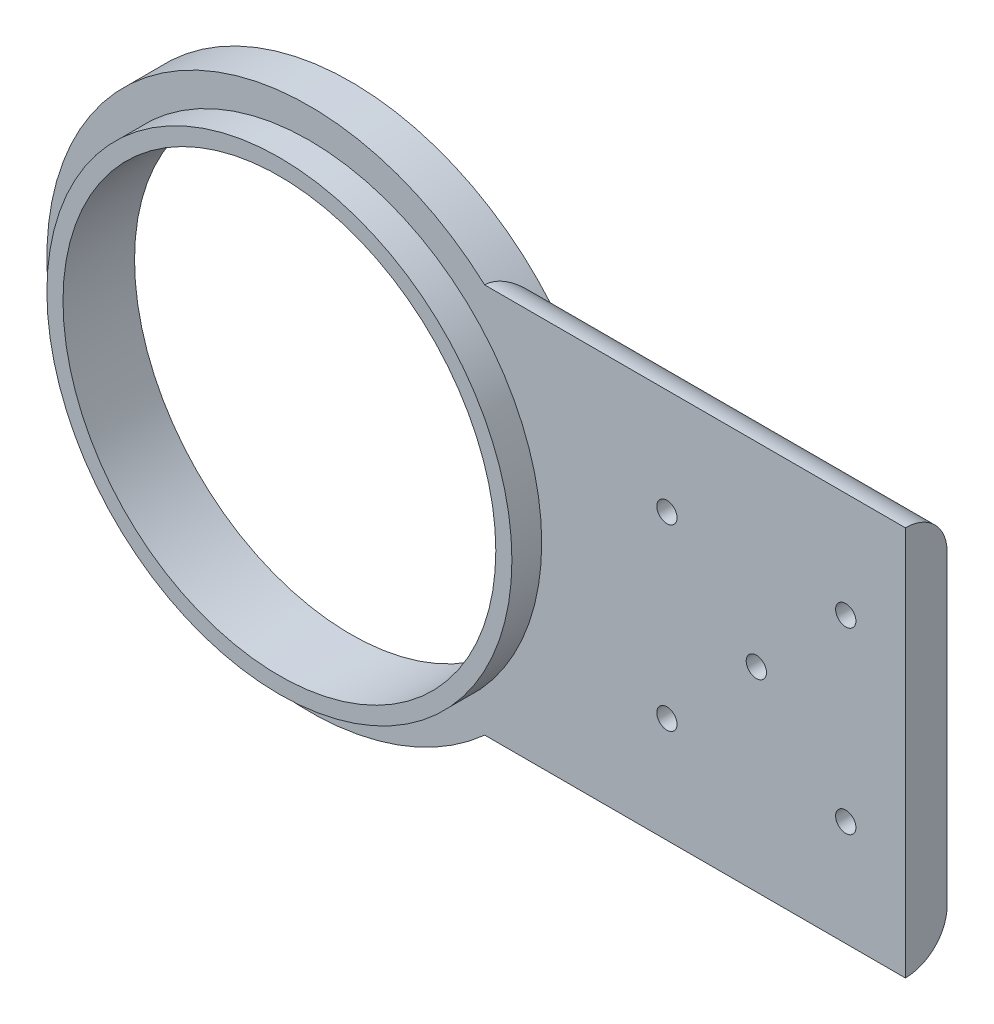
ISO-10303-21;
HEADER;
FILE_DESCRIPTION(('STEP AP214'),'2;1');
FILE_NAME('part.step','',(''),(''),'','','');
FILE_SCHEMA(('AUTOMOTIVE_DESIGN { 1 0 10303 214 1 1 1 1 }'));
ENDSEC;
DATA;
#1=APPLICATION_CONTEXT('core data for automotive mechanical design processes');
#2=APPLICATION_PROTOCOL_DEFINITION('international standard','automotive_design',2000,#1);
#3=PRODUCT_CONTEXT('',#1,'mechanical');
#4=PRODUCT('Part','Part','',(#3));
#5=PRODUCT_RELATED_PRODUCT_CATEGORY('part','',(#4));
#6=PRODUCT_DEFINITION_FORMATION('','',#4);
#7=PRODUCT_DEFINITION_CONTEXT('part definition',#1,'design');
#8=PRODUCT_DEFINITION('design','',#6,#7);
#9=PRODUCT_DEFINITION_SHAPE('','',#8);
#10=(LENGTH_UNIT() NAMED_UNIT(*) SI_UNIT(.MILLI.,.METRE.));
#11=(NAMED_UNIT(*) PLANE_ANGLE_UNIT() SI_UNIT($,.RADIAN.));
#12=(NAMED_UNIT(*) SI_UNIT($,.STERADIAN.) SOLID_ANGLE_UNIT());
#13=UNCERTAINTY_MEASURE_WITH_UNIT(LENGTH_MEASURE(1.E-05),#10,'distance_accuracy_value','');
#14=(GEOMETRIC_REPRESENTATION_CONTEXT(3) GLOBAL_UNCERTAINTY_ASSIGNED_CONTEXT((#13)) GLOBAL_UNIT_ASSIGNED_CONTEXT((#10,
#11,#12)) REPRESENTATION_CONTEXT('',''));
#15=CARTESIAN_POINT('',(0.,0.,0.));
#16=DIRECTION('',(0.,0.,1.));
#17=DIRECTION('',(1.,0.,0.));
#18=AXIS2_PLACEMENT_3D('',#15,#16,#17);
#19=CARTESIAN_POINT('',(0.,0.,2.5));
#20=DIRECTION('',(0.,0.,1.));
#21=DIRECTION('',(1.,0.,0.));
#22=AXIS2_PLACEMENT_3D('',#19,#20,#21);
#23=PLANE('',#22);
#24=CARTESIAN_POINT('',(0.,0.,2.5));
#25=DIRECTION('',(0.,0.,1.));
#26=DIRECTION('',(1.,0.,0.));
#27=AXIS2_PLACEMENT_3D('',#24,#25,#26);
#28=CIRCLE('',#27,39.);
#29=CARTESIAN_POINT('',(39.,0.,2.5));
#30=VERTEX_POINT('',#29);
#31=EDGE_CURVE('E149',#30,#30,#28,.T.);
#32=ORIENTED_EDGE('',*,*,#31,.T.);
#33=EDGE_LOOP('',(#32));
#34=FACE_BOUND('',#33,.T.);
#35=CARTESIAN_POINT('',(0.,0.,2.5));
#36=DIRECTION('',(0.,0.,1.));
#37=DIRECTION('',(1.,0.,0.));
#38=AXIS2_PLACEMENT_3D('',#35,#36,#37);
#39=CIRCLE('',#38,36.3);
#40=CARTESIAN_POINT('',(36.3,0.,2.5));
#41=VERTEX_POINT('',#40);
#42=EDGE_CURVE('E136',#41,#41,#39,.T.);
#43=ORIENTED_EDGE('',*,*,#42,.F.);
#44=EDGE_LOOP('',(#43));
#45=FACE_BOUND('',#44,.T.);
#46=ADVANCED_FACE('F35',(#34,#45),#23,.T.);
#47=CARTESIAN_POINT('',(0.,0.,2.5));
#48=DIRECTION('',(0.,0.,-1.));
#49=DIRECTION('',(-1.,0.,0.));
#50=AXIS2_PLACEMENT_3D('',#47,#48,#49);
#51=CYLINDRICAL_SURFACE('',#50,39.);
#52=ORIENTED_EDGE('',*,*,#31,.F.);
#53=EDGE_LOOP('',(#52));
#54=FACE_BOUND('',#53,.T.);
#55=CARTESIAN_POINT('',(0.,0.,-2.5));
#56=DIRECTION('',(0.,0.,1.));
#57=DIRECTION('',(1.,0.,0.));
#58=AXIS2_PLACEMENT_3D('',#55,#56,#57);
#59=CIRCLE('',#58,39.);
#60=CARTESIAN_POINT('',(39.,0.,-2.5));
#61=VERTEX_POINT('',#60);
#62=EDGE_CURVE('E146',#61,#61,#59,.T.);
#63=ORIENTED_EDGE('',*,*,#62,.T.);
#64=EDGE_LOOP('',(#63));
#65=FACE_BOUND('',#64,.T.);
#66=ADVANCED_FACE('F117',(#54,#65),#51,.T.);
#67=CARTESIAN_POINT('',(0.,0.,2.5));
#68=DIRECTION('',(0.,0.,-1.));
#69=DIRECTION('',(-1.,0.,0.));
#70=AXIS2_PLACEMENT_3D('',#67,#68,#69);
#71=CYLINDRICAL_SURFACE('',#70,36.3);
#72=ORIENTED_EDGE('',*,*,#42,.T.);
#73=EDGE_LOOP('',(#72));
#74=FACE_BOUND('',#73,.T.);
#75=CARTESIAN_POINT('',(0.,0.,-9.5));
#76=DIRECTION('',(0.,0.,-1.));
#77=DIRECTION('',(-1.,0.,0.));
#78=AXIS2_PLACEMENT_3D('',#75,#76,#77);
#79=CIRCLE('',#78,36.3);
#80=CARTESIAN_POINT('',(-36.3,0.,-9.5));
#81=VERTEX_POINT('',#80);
#82=EDGE_CURVE('E139',#81,#81,#79,.T.);
#83=ORIENTED_EDGE('',*,*,#82,.T.);
#84=EDGE_LOOP('',(#83));
#85=FACE_BOUND('',#84,.T.);
#86=ADVANCED_FACE('F120',(#74,#85),#71,.F.);
#87=CARTESIAN_POINT('',(0.,0.,-9.5));
#88=DIRECTION('',(0.,0.,-1.));
#89=DIRECTION('',(-1.,0.,0.));
#90=AXIS2_PLACEMENT_3D('',#87,#88,#89);
#91=PLANE('',#90);
#92=CARTESIAN_POINT('',(75.,0.,-9.5));
#93=DIRECTION('',(0.,0.,-1.));
#94=DIRECTION('',(-1.,0.,0.));
#95=AXIS2_PLACEMENT_3D('',#92,#93,#94);
#96=CIRCLE('',#95,3.5);
#97=CARTESIAN_POINT('',(71.5,0.,-9.5));
#98=VERTEX_POINT('',#97);
#99=EDGE_CURVE('E216',#98,#98,#96,.T.);
#100=ORIENTED_EDGE('',*,*,#99,.F.);
#101=EDGE_LOOP('',(#100));
#102=FACE_BOUND('',#101,.T.);
#103=CARTESIAN_POINT('',(90.,15.,-9.5));
#104=DIRECTION('',(0.,0.,-1.));
#105=DIRECTION('',(-1.,0.,0.));
#106=AXIS2_PLACEMENT_3D('',#103,#104,#105);
#107=CIRCLE('',#106,3.49999999999999);
#108=CARTESIAN_POINT('',(86.5,15.,-9.5));
#109=VERTEX_POINT('',#108);
#110=EDGE_CURVE('E204',#109,#109,#107,.T.);
#111=ORIENTED_EDGE('',*,*,#110,.F.);
#112=EDGE_LOOP('',(#111));
#113=FACE_BOUND('',#112,.T.);
#114=CARTESIAN_POINT('',(60.,-15.,-9.5));
#115=DIRECTION('',(0.,0.,-1.));
#116=DIRECTION('',(-1.,0.,0.));
#117=AXIS2_PLACEMENT_3D('',#114,#115,#116);
#118=CIRCLE('',#117,3.49999999999999);
#119=CARTESIAN_POINT('',(56.5,-15.,-9.5));
#120=VERTEX_POINT('',#119);
#121=EDGE_CURVE('E192',#120,#120,#118,.T.);
#122=ORIENTED_EDGE('',*,*,#121,.F.);
#123=EDGE_LOOP('',(#122));
#124=FACE_BOUND('',#123,.T.);
#125=CARTESIAN_POINT('',(60.,15.,-9.5));
#126=DIRECTION('',(0.,0.,-1.));
#127=DIRECTION('',(-1.,0.,0.));
#128=AXIS2_PLACEMENT_3D('',#125,#126,#127);
#129=CIRCLE('',#128,3.49999999999999);
#130=CARTESIAN_POINT('',(56.5,15.,-9.5));
#131=VERTEX_POINT('',#130);
#132=EDGE_CURVE('E180',#131,#131,#129,.T.);
#133=ORIENTED_EDGE('',*,*,#132,.F.);
#134=EDGE_LOOP('',(#133));
#135=FACE_BOUND('',#134,.T.);
#136=CARTESIAN_POINT('',(90.,-15.,-9.5));
#137=DIRECTION('',(0.,0.,-1.));
#138=DIRECTION('',(-1.,0.,0.));
#139=AXIS2_PLACEMENT_3D('',#136,#137,#138);
#140=CIRCLE('',#139,3.49999999999999);
#141=CARTESIAN_POINT('',(86.5,-15.,-9.5));
#142=VERTEX_POINT('',#141);
#143=EDGE_CURVE('E168',#142,#142,#140,.T.);
#144=ORIENTED_EDGE('',*,*,#143,.F.);
#145=EDGE_LOOP('',(#144));
#146=FACE_BOUND('',#145,.T.);
#147=DIRECTION('',(0.,-1.,0.));
#148=VECTOR('',#147,1.);
#149=CARTESIAN_POINT('',(100.,0.,-9.5));
#150=LINE('',#149,#148);
#151=CARTESIAN_POINT('',(100.,25.7,-9.5));
#152=VERTEX_POINT('',#151);
#153=CARTESIAN_POINT('',(100.,-25.7,-9.5));
#154=VERTEX_POINT('',#153);
#155=EDGE_CURVE('E98',#152,#154,#150,.T.);
#156=ORIENTED_EDGE('',*,*,#155,.T.);
#157=DIRECTION('',(-1.,0.,0.));
#158=VECTOR('',#157,1.);
#159=CARTESIAN_POINT('',(0.,-25.7,-9.5));
#160=LINE('',#159,#158);
#161=CARTESIAN_POINT('',(35.7142828571427,-25.7,-9.5));
#162=VERTEX_POINT('',#161);
#163=EDGE_CURVE('E102',#154,#162,#160,.T.);
#164=ORIENTED_EDGE('',*,*,#163,.T.);
#165=CARTESIAN_POINT('',(0.,0.,-9.5));
#166=DIRECTION('',(0.,0.,-1.));
#167=DIRECTION('',(-1.,0.,0.));
#168=AXIS2_PLACEMENT_3D('',#165,#166,#167);
#169=CIRCLE('',#168,44.);
#170=CARTESIAN_POINT('',(35.7142828571427,25.7,-9.5));
#171=VERTEX_POINT('',#170);
#172=EDGE_CURVE('E55',#162,#171,#169,.T.);
#173=ORIENTED_EDGE('',*,*,#172,.T.);
#174=DIRECTION('',(1.,0.,0.));
#175=VECTOR('',#174,1.);
#176=CARTESIAN_POINT('',(0.,25.7,-9.5));
#177=LINE('',#176,#175);
#178=EDGE_CURVE('E152',#171,#152,#177,.T.);
#179=ORIENTED_EDGE('',*,*,#178,.T.);
#180=EDGE_LOOP('',(#156,#164,#173,#179));
#181=FACE_BOUND('',#180,.T.);
#182=ORIENTED_EDGE('',*,*,#82,.F.);
#183=EDGE_LOOP('',(#182));
#184=FACE_BOUND('',#183,.T.);
#185=ADVANCED_FACE('F125',(#102,#113,#124,#135,#146,#181,#184),#91,.T.);
#186=CARTESIAN_POINT('',(0.,0.,-2.5));
#187=DIRECTION('',(0.,0.,-1.));
#188=DIRECTION('',(-1.,0.,0.));
#189=AXIS2_PLACEMENT_3D('',#186,#187,#188);
#190=PLANE('',#189);
#191=CARTESIAN_POINT('',(75.,0.,-2.5));
#192=DIRECTION('',(0.,0.,-1.));
#193=DIRECTION('',(-1.,0.,0.));
#194=AXIS2_PLACEMENT_3D('',#191,#192,#193);
#195=CIRCLE('',#194,1.7);
#196=CARTESIAN_POINT('',(73.3,0.,-2.5));
#197=VERTEX_POINT('',#196);
#198=EDGE_CURVE('E207',#197,#197,#195,.T.);
#199=ORIENTED_EDGE('',*,*,#198,.T.);
#200=EDGE_LOOP('',(#199));
#201=FACE_BOUND('',#200,.T.);
#202=CARTESIAN_POINT('',(90.,15.,-2.5));
#203=DIRECTION('',(0.,0.,-1.));
#204=DIRECTION('',(-1.,0.,0.));
#205=AXIS2_PLACEMENT_3D('',#202,#203,#204);
#206=CIRCLE('',#205,1.7);
#207=CARTESIAN_POINT('',(88.3,15.,-2.5));
#208=VERTEX_POINT('',#207);
#209=EDGE_CURVE('E195',#208,#208,#206,.T.);
#210=ORIENTED_EDGE('',*,*,#209,.T.);
#211=EDGE_LOOP('',(#210));
#212=FACE_BOUND('',#211,.T.);
#213=CARTESIAN_POINT('',(60.,-15.,-2.5));
#214=DIRECTION('',(0.,0.,-1.));
#215=DIRECTION('',(-1.,0.,0.));
#216=AXIS2_PLACEMENT_3D('',#213,#214,#215);
#217=CIRCLE('',#216,1.70000000000001);
#218=CARTESIAN_POINT('',(58.3,-15.,-2.5));
#219=VERTEX_POINT('',#218);
#220=EDGE_CURVE('E183',#219,#219,#217,.T.);
#221=ORIENTED_EDGE('',*,*,#220,.T.);
#222=EDGE_LOOP('',(#221));
#223=FACE_BOUND('',#222,.T.);
#224=CARTESIAN_POINT('',(60.,15.,-2.5));
#225=DIRECTION('',(0.,0.,-1.));
#226=DIRECTION('',(-1.,0.,0.));
#227=AXIS2_PLACEMENT_3D('',#224,#225,#226);
#228=CIRCLE('',#227,1.70000000000001);
#229=CARTESIAN_POINT('',(58.3,15.,-2.5));
#230=VERTEX_POINT('',#229);
#231=EDGE_CURVE('E171',#230,#230,#228,.T.);
#232=ORIENTED_EDGE('',*,*,#231,.T.);
#233=EDGE_LOOP('',(#232));
#234=FACE_BOUND('',#233,.T.);
#235=CARTESIAN_POINT('',(90.,-15.,-2.5));
#236=DIRECTION('',(0.,0.,-1.));
#237=DIRECTION('',(-1.,0.,0.));
#238=AXIS2_PLACEMENT_3D('',#235,#236,#237);
#239=CIRCLE('',#238,1.7);
#240=CARTESIAN_POINT('',(88.3,-15.,-2.5));
#241=VERTEX_POINT('',#240);
#242=EDGE_CURVE('E156',#241,#241,#239,.T.);
#243=ORIENTED_EDGE('',*,*,#242,.T.);
#244=EDGE_LOOP('',(#243));
#245=FACE_BOUND('',#244,.T.);
#246=ORIENTED_EDGE('',*,*,#62,.F.);
#247=EDGE_LOOP('',(#246));
#248=FACE_BOUND('',#247,.T.);
#249=CARTESIAN_POINT('',(0.,0.,-2.5));
#250=DIRECTION('',(0.,0.,-1.));
#251=DIRECTION('',(-1.,0.,0.));
#252=AXIS2_PLACEMENT_3D('',#249,#250,#251);
#253=CIRCLE('',#252,44.);
#254=CARTESIAN_POINT('',(29.4399388586322,-32.7,-2.5));
#255=VERTEX_POINT('',#254);
#256=CARTESIAN_POINT('',(29.4399388586322,32.7,-2.5));
#257=VERTEX_POINT('',#256);
#258=EDGE_CURVE('E87',#255,#257,#253,.T.);
#259=ORIENTED_EDGE('',*,*,#258,.F.);
#260=DIRECTION('',(-1.,0.,0.));
#261=VECTOR('',#260,1.);
#262=CARTESIAN_POINT('',(0.,-32.7,-2.5));
#263=LINE('',#262,#261);
#264=CARTESIAN_POINT('',(100.,-32.7,-2.5));
#265=VERTEX_POINT('',#264);
#266=EDGE_CURVE('E81',#265,#255,#263,.T.);
#267=ORIENTED_EDGE('',*,*,#266,.F.);
#268=DIRECTION('',(0.,-1.,0.));
#269=VECTOR('',#268,1.);
#270=CARTESIAN_POINT('',(100.,0.,-2.5));
#271=LINE('',#270,#269);
#272=CARTESIAN_POINT('',(100.,32.7,-2.5));
#273=VERTEX_POINT('',#272);
#274=EDGE_CURVE('E84',#273,#265,#271,.T.);
#275=ORIENTED_EDGE('',*,*,#274,.F.);
#276=DIRECTION('',(1.,0.,0.));
#277=VECTOR('',#276,1.);
#278=CARTESIAN_POINT('',(0.,32.7,-2.5));
#279=LINE('',#278,#277);
#280=EDGE_CURVE('E90',#257,#273,#279,.T.);
#281=ORIENTED_EDGE('',*,*,#280,.F.);
#282=EDGE_LOOP('',(#259,#267,#275,#281));
#283=FACE_BOUND('',#282,.T.);
#284=ADVANCED_FACE('F83',(#201,#212,#223,#234,#245,#248,#283),#190,.F.);
#285=CARTESIAN_POINT('',(0.,0.,-9.5));
#286=DIRECTION('',(0.,0.,1.));
#287=DIRECTION('',(1.,0.,0.));
#288=AXIS2_PLACEMENT_3D('',#285,#286,#287);
#289=CYLINDRICAL_SURFACE('',#288,44.);
#290=ORIENTED_EDGE('',*,*,#258,.T.);
#291=CARTESIAN_POINT('',(29.4399388586322,32.7,-2.5));
#292=CARTESIAN_POINT('',(29.4398766875365,32.7000450028481,-2.65545138000345));
#293=CARTESIAN_POINT('',(29.445687973902,32.6948238699683,-2.81086230386652));
#294=CARTESIAN_POINT('',(29.4685828220113,32.6741955210922,-3.11999626718906));
#295=CARTESIAN_POINT('',(29.4856533746035,32.6588000606501,-3.27372104670377));
#296=CARTESIAN_POINT('',(29.5303523646038,32.6183863673693,-3.57660282398693));
#297=CARTESIAN_POINT('',(29.557865238129,32.5934734440298,-3.72579117143139));
#298=CARTESIAN_POINT('',(29.622677472481,32.5345801471951,-4.02021403567719));
#299=CARTESIAN_POINT('',(29.6599790953231,32.5005976778495,-4.16544763002833));
#300=CARTESIAN_POINT('',(29.7432479180591,32.4244099891528,-4.45037427420801));
#301=CARTESIAN_POINT('',(29.7891729902026,32.38224471268,-4.59009042225513));
#302=CARTESIAN_POINT('',(29.8888392127081,32.2902754138045,-4.86414458544281));
#303=CARTESIAN_POINT('',(29.9425834572352,32.2404683670095,-4.99848044455866));
#304=CARTESIAN_POINT('',(30.1143483347493,32.0803767153323,-5.39336730521262));
#305=CARTESIAN_POINT('',(30.2427221005896,31.9595837459656,-5.64520817510407));
#306=CARTESIAN_POINT('',(30.5902845285716,31.6277911188509,-6.24589913685462));
#307=CARTESIAN_POINT('',(30.8224922746371,31.4021274828868,-6.57909408184711));
#308=CARTESIAN_POINT('',(31.1917024655347,31.0339893115964,-7.03729922479673));
#309=CARTESIAN_POINT('',(31.3184578343894,30.9061258138074,-7.18328730428158));
#310=CARTESIAN_POINT('',(31.577456779897,30.6414486700055,-7.46174935180353));
#311=CARTESIAN_POINT('',(31.7097002280971,30.5046352334298,-7.59422363589107));
#312=CARTESIAN_POINT('',(32.0200107871575,30.1791978405078,-7.88498955753227));
#313=CARTESIAN_POINT('',(32.1995382406815,29.9876936343355,-8.03849719478221));
#314=CARTESIAN_POINT('',(32.5630778510973,29.5925342686785,-8.32301113188843));
#315=CARTESIAN_POINT('',(32.7470914535822,29.3888751610135,-8.45401006623395));
#316=CARTESIAN_POINT('',(33.1174182977031,28.9709256887962,-8.69346589163776));
#317=CARTESIAN_POINT('',(33.3037303576188,28.7566406292455,-8.80193389365694));
#318=CARTESIAN_POINT('',(33.6769762761854,28.3186161713314,-8.99616988215624));
#319=CARTESIAN_POINT('',(33.8639099763755,28.094879034153,-9.0819432625233));
#320=CARTESIAN_POINT('',(34.1918494554241,27.6941757073638,-9.21239936077562));
#321=CARTESIAN_POINT('',(34.333051245275,27.5189537741622,-9.26200302700973));
#322=CARTESIAN_POINT('',(34.6142990024423,27.1643425220704,-9.3475511697702));
#323=CARTESIAN_POINT('',(34.754345205937,26.984954084831,-9.38349850859113));
#324=CARTESIAN_POINT('',(35.0324189122398,26.6229516228606,-9.44130356952646));
#325=CARTESIAN_POINT('',(35.170449886823,26.440344752155,-9.46318927507413));
#326=CARTESIAN_POINT('',(35.4442355712065,26.072188969215,-9.49253602704512));
#327=CARTESIAN_POINT('',(35.5799894317423,25.8866390074175,-9.49999180531741));
#328=CARTESIAN_POINT('',(35.7142828571427,25.7,-9.5));
#329=B_SPLINE_CURVE_WITH_KNOTS('',3,(#291,#292,#293,#294,#295,#296,#297,#298,#299,#300,#301,
#302,#303,#304,#305,#306,#307,#308,#309,#310,#311,#312,#313,#314,#315,#316,#317,#318,#319,#320,
#321,#322,#323,#324,#325,#326,#327,#328),.UNSPECIFIED.,.F.,.F.,(4,2,2,2,2,2,2,2,2,2,2,2,2,2,2,2,
2,2,4),(0.,0.466093910347459,0.931650228881097,1.39219781533933,1.8528519204597,
2.31131155342498,2.76995310177284,3.68912648400209,5.07492020264519,5.76986757850174,
6.46479869772559,7.37585526187326,8.28720938514435,9.19811300833575,10.1087999399369,
10.7996959112562,11.4904469944071,12.1798191515142,12.8694429406647),.UNSPECIFIED.);
#330=EDGE_CURVE('E11',#257,#171,#329,.T.);
#331=ORIENTED_EDGE('',*,*,#330,.T.);
#332=ORIENTED_EDGE('',*,*,#172,.F.);
#333=CARTESIAN_POINT('',(35.7142828571427,-25.7,-9.5));
#334=CARTESIAN_POINT('',(35.5411455416622,-25.9406472638096,-9.49997547616842));
#335=CARTESIAN_POINT('',(35.3655791737305,-26.1794518642754,-9.48759226462794));
#336=CARTESIAN_POINT('',(35.0109282607202,-26.6518570518179,-9.43904964150754));
#337=CARTESIAN_POINT('',(34.8318449988826,-26.8854594730273,-9.4028987514375));
#338=CARTESIAN_POINT('',(34.470575116445,-27.3471374537865,-9.30754965978854));
#339=CARTESIAN_POINT('',(34.2883782561158,-27.5751839131345,-9.24824997301075));
#340=CARTESIAN_POINT('',(33.9229790248938,-28.0234737853718,-9.10732090745128));
#341=CARTESIAN_POINT('',(33.7397765412782,-28.243716301981,-9.02568897314734));
#342=CARTESIAN_POINT('',(33.3675173006057,-28.6826502431877,-8.83741090488728));
#343=CARTESIAN_POINT('',(33.1784759856104,-28.9010275984769,-8.73000078307939));
#344=CARTESIAN_POINT('',(32.8026220511431,-29.3269270441503,-8.49207086623085));
#345=CARTESIAN_POINT('',(32.6158097481543,-29.5344476068781,-8.36154783024727));
#346=CARTESIAN_POINT('',(32.2468116536458,-29.9368929282948,-8.07757198160712));
#347=CARTESIAN_POINT('',(32.0646194209388,-30.1318358834685,-7.92415340891452));
#348=CARTESIAN_POINT('',(31.707189112114,-30.5077257615856,-7.59395006211047));
#349=CARTESIAN_POINT('',(31.5319476821536,-30.6886794755073,-7.41717673974218));
#350=CARTESIAN_POINT('',(31.2504341020229,-30.9747579059677,-7.10488670086521));
#351=CARTESIAN_POINT('',(31.14124227132,-31.0844899325107,-6.97620269898638));
#352=CARTESIAN_POINT('',(30.9283726546493,-31.2962996021192,-6.7083963823785));
#353=CARTESIAN_POINT('',(30.8246958303742,-31.3983759114642,-6.56927225725766));
#354=CARTESIAN_POINT('',(30.524188358359,-31.6915075015185,-6.1363626324087));
#355=CARTESIAN_POINT('',(30.3373647360979,-31.8699858706231,-5.82648204968799));
#356=CARTESIAN_POINT('',(30.0427694235296,-32.1475265441343,-5.24026763972882));
#357=CARTESIAN_POINT('',(29.9266845133354,-32.2554180780409,-4.972372478348));
#358=CARTESIAN_POINT('',(29.7770700825309,-32.3933740460417,-4.55433075051744));
#359=CARTESIAN_POINT('',(29.7313108280473,-32.4353551735335,-4.41240323079478));
#360=CARTESIAN_POINT('',(29.6488997348107,-32.5107039333208,-4.12373629116211));
#361=CARTESIAN_POINT('',(29.6122424612806,-32.5440767061148,-3.9769998022222));
#362=CARTESIAN_POINT('',(29.5577053018995,-32.5936038193912,-3.72075441957938));
#363=CARTESIAN_POINT('',(29.53743602812,-32.6119676090614,-3.61217127452552));
#364=CARTESIAN_POINT('',(29.5024362930314,-32.6436335015704,-3.39340043074634));
#365=CARTESIAN_POINT('',(29.4877045504821,-32.6569367752891,-3.28321310932178));
#366=CARTESIAN_POINT('',(29.4639574017026,-32.6783641976883,-3.0611778170978));
#367=CARTESIAN_POINT('',(29.4549699755538,-32.6864629968351,-2.9493243932161));
#368=CARTESIAN_POINT('',(29.4429504323637,-32.6972885904112,-2.7249838429432));
#369=CARTESIAN_POINT('',(29.4399213178356,-32.7000126764162,-2.61249642568728));
#370=CARTESIAN_POINT('',(29.4399388586322,-32.7,-2.5));
#371=B_SPLINE_CURVE_WITH_KNOTS('',3,(#333,#334,#335,#336,#337,#338,#339,#340,#341,#342,#343,
#344,#345,#346,#347,#348,#349,#350,#351,#352,#353,#354,#355,#356,#357,#358,#359,#360,#361,#362,
#363,#364,#365,#366,#367,#368,#369,#370),.UNSPECIFIED.,.F.,.F.,(4,2,2,2,2,2,2,2,2,2,2,2,2,2,2,2,
2,2,4),(0.,0.888992491001515,1.77766642206851,2.67028089597407,3.56299755623597,
4.48642824189909,5.40998851569815,6.33218120743388,7.25392337889654,7.85737009769857,
8.46092170135212,9.66528667578505,10.5952969369037,11.0595625980628,11.5235503767394,
11.8592366184204,12.1948451431847,12.5320761752301,12.869477101297),.UNSPECIFIED.);
#372=EDGE_CURVE('E49',#162,#255,#371,.T.);
#373=ORIENTED_EDGE('',*,*,#372,.T.);
#374=EDGE_LOOP('',(#290,#331,#332,#373));
#375=FACE_BOUND('',#374,.T.);
#376=ADVANCED_FACE('F110',(#375),#289,.T.);
#377=CARTESIAN_POINT('',(100.,0.,-2.5));
#378=DIRECTION('',(1.,0.,0.));
#379=DIRECTION('',(0.,0.,-1.));
#380=AXIS2_PLACEMENT_3D('',#377,#378,#379);
#381=PLANE('',#380);
#382=ORIENTED_EDGE('',*,*,#274,.T.);
#383=CARTESIAN_POINT('',(100.,-25.7,-2.5));
#384=DIRECTION('',(1.,0.,0.));
#385=DIRECTION('',(0.,0.,-1.));
#386=AXIS2_PLACEMENT_3D('',#383,#384,#385);
#387=CIRCLE('',#386,7.);
#388=EDGE_CURVE('E95',#265,#154,#387,.T.);
#389=ORIENTED_EDGE('',*,*,#388,.T.);
#390=ORIENTED_EDGE('',*,*,#155,.F.);
#391=CARTESIAN_POINT('',(100.,25.7,-2.5));
#392=DIRECTION('',(1.,0.,0.));
#393=DIRECTION('',(0.,0.,-1.));
#394=AXIS2_PLACEMENT_3D('',#391,#392,#393);
#395=CIRCLE('',#394,7.);
#396=EDGE_CURVE('E97',#152,#273,#395,.T.);
#397=ORIENTED_EDGE('',*,*,#396,.T.);
#398=EDGE_LOOP('',(#382,#389,#390,#397));
#399=FACE_BOUND('',#398,.T.);
#400=ADVANCED_FACE('F93',(#399),#381,.T.);
#401=CARTESIAN_POINT('',(0.,-25.7,-2.5));
#402=DIRECTION('',(-1.,0.,0.));
#403=DIRECTION('',(0.,0.,1.));
#404=AXIS2_PLACEMENT_3D('',#401,#402,#403);
#405=CYLINDRICAL_SURFACE('',#404,7.);
#406=ORIENTED_EDGE('',*,*,#388,.F.);
#407=ORIENTED_EDGE('',*,*,#266,.T.);
#408=ORIENTED_EDGE('',*,*,#372,.F.);
#409=ORIENTED_EDGE('',*,*,#163,.F.);
#410=EDGE_LOOP('',(#406,#407,#408,#409));
#411=FACE_BOUND('',#410,.T.);
#412=ADVANCED_FACE('F101',(#411),#405,.T.);
#413=CARTESIAN_POINT('',(0.,25.7,-2.5));
#414=DIRECTION('',(1.,0.,0.));
#415=DIRECTION('',(0.,0.,-1.));
#416=AXIS2_PLACEMENT_3D('',#413,#414,#415);
#417=CYLINDRICAL_SURFACE('',#416,7.);
#418=ORIENTED_EDGE('',*,*,#330,.F.);
#419=ORIENTED_EDGE('',*,*,#280,.T.);
#420=ORIENTED_EDGE('',*,*,#396,.F.);
#421=ORIENTED_EDGE('',*,*,#178,.F.);
#422=EDGE_LOOP('',(#418,#419,#420,#421));
#423=FACE_BOUND('',#422,.T.);
#424=ADVANCED_FACE('F37',(#423),#417,.T.);
#425=CARTESIAN_POINT('',(90.,-15.,-9.5));
#426=DIRECTION('',(0.,0.,-1.));
#427=DIRECTION('',(-1.,0.,0.));
#428=AXIS2_PLACEMENT_3D('',#425,#426,#427);
#429=CYLINDRICAL_SURFACE('',#428,1.7);
#430=ORIENTED_EDGE('',*,*,#242,.F.);
#431=EDGE_LOOP('',(#430));
#432=FACE_BOUND('',#431,.T.);
#433=CARTESIAN_POINT('',(90.,-15.,-7.1));
#434=DIRECTION('',(0.,0.,-1.));
#435=DIRECTION('',(-1.,0.,0.));
#436=AXIS2_PLACEMENT_3D('',#433,#434,#435);
#437=CIRCLE('',#436,1.70000000000001);
#438=CARTESIAN_POINT('',(88.3,-15.,-7.1));
#439=VERTEX_POINT('',#438);
#440=EDGE_CURVE('E158',#439,#439,#437,.T.);
#441=ORIENTED_EDGE('',*,*,#440,.T.);
#442=EDGE_LOOP('',(#441));
#443=FACE_BOUND('',#442,.T.);
#444=ADVANCED_FACE('F243',(#432,#443),#429,.F.);
#445=CARTESIAN_POINT('',(91.7,-15.,-7.1));
#446=DIRECTION('',(0.,0.,1.));
#447=DIRECTION('',(1.,0.,0.));
#448=AXIS2_PLACEMENT_3D('',#445,#446,#447);
#449=PLANE('',#448);
#450=ORIENTED_EDGE('',*,*,#440,.F.);
#451=EDGE_LOOP('',(#450));
#452=FACE_BOUND('',#451,.T.);
#453=CARTESIAN_POINT('',(90.,-15.,-7.1));
#454=DIRECTION('',(0.,0.,-1.));
#455=DIRECTION('',(-1.,0.,0.));
#456=AXIS2_PLACEMENT_3D('',#453,#454,#455);
#457=CIRCLE('',#456,3.49999999999999);
#458=CARTESIAN_POINT('',(86.5,-15.,-7.1));
#459=VERTEX_POINT('',#458);
#460=EDGE_CURVE('E163',#459,#459,#457,.T.);
#461=ORIENTED_EDGE('',*,*,#460,.T.);
#462=EDGE_LOOP('',(#461));
#463=FACE_BOUND('',#462,.T.);
#464=ADVANCED_FACE('F233',(#452,#463),#449,.F.);
#465=CARTESIAN_POINT('',(90.,-15.,-9.5));
#466=DIRECTION('',(0.,0.,-1.));
#467=DIRECTION('',(-1.,0.,0.));
#468=AXIS2_PLACEMENT_3D('',#465,#466,#467);
#469=CYLINDRICAL_SURFACE('',#468,3.49999999999999);
#470=ORIENTED_EDGE('',*,*,#460,.F.);
#471=EDGE_LOOP('',(#470));
#472=FACE_BOUND('',#471,.T.);
#473=ORIENTED_EDGE('',*,*,#143,.T.);
#474=EDGE_LOOP('',(#473));
#475=FACE_BOUND('',#474,.T.);
#476=ADVANCED_FACE('F230',(#472,#475),#469,.F.);
#477=CARTESIAN_POINT('',(60.,15.,-9.5));
#478=DIRECTION('',(0.,0.,-1.));
#479=DIRECTION('',(-1.,0.,0.));
#480=AXIS2_PLACEMENT_3D('',#477,#478,#479);
#481=CYLINDRICAL_SURFACE('',#480,1.70000000000001);
#482=ORIENTED_EDGE('',*,*,#231,.F.);
#483=EDGE_LOOP('',(#482));
#484=FACE_BOUND('',#483,.T.);
#485=CARTESIAN_POINT('',(60.,15.,-7.1));
#486=DIRECTION('',(0.,0.,-1.));
#487=DIRECTION('',(-1.,0.,0.));
#488=AXIS2_PLACEMENT_3D('',#485,#486,#487);
#489=CIRCLE('',#488,1.70000000000001);
#490=CARTESIAN_POINT('',(58.3,15.,-7.1));
#491=VERTEX_POINT('',#490);
#492=EDGE_CURVE('E174',#491,#491,#489,.T.);
#493=ORIENTED_EDGE('',*,*,#492,.T.);
#494=EDGE_LOOP('',(#493));
#495=FACE_BOUND('',#494,.T.);
#496=ADVANCED_FACE('F232',(#484,#495),#481,.F.);
#497=CARTESIAN_POINT('',(61.7,15.,-7.1));
#498=DIRECTION('',(0.,0.,1.));
#499=DIRECTION('',(1.,0.,0.));
#500=AXIS2_PLACEMENT_3D('',#497,#498,#499);
#501=PLANE('',#500);
#502=ORIENTED_EDGE('',*,*,#492,.F.);
#503=EDGE_LOOP('',(#502));
#504=FACE_BOUND('',#503,.T.);
#505=CARTESIAN_POINT('',(60.,15.,-7.1));
#506=DIRECTION('',(0.,0.,-1.));
#507=DIRECTION('',(-1.,0.,0.));
#508=AXIS2_PLACEMENT_3D('',#505,#506,#507);
#509=CIRCLE('',#508,3.49999999999999);
#510=CARTESIAN_POINT('',(56.5,15.,-7.1));
#511=VERTEX_POINT('',#510);
#512=EDGE_CURVE('E177',#511,#511,#509,.T.);
#513=ORIENTED_EDGE('',*,*,#512,.T.);
#514=EDGE_LOOP('',(#513));
#515=FACE_BOUND('',#514,.T.);
#516=ADVANCED_FACE('F240',(#504,#515),#501,.F.);
#517=CARTESIAN_POINT('',(60.,15.,-9.5));
#518=DIRECTION('',(0.,0.,-1.));
#519=DIRECTION('',(-1.,0.,0.));
#520=AXIS2_PLACEMENT_3D('',#517,#518,#519);
#521=CYLINDRICAL_SURFACE('',#520,3.49999999999999);
#522=ORIENTED_EDGE('',*,*,#512,.F.);
#523=EDGE_LOOP('',(#522));
#524=FACE_BOUND('',#523,.T.);
#525=ORIENTED_EDGE('',*,*,#132,.T.);
#526=EDGE_LOOP('',(#525));
#527=FACE_BOUND('',#526,.T.);
#528=ADVANCED_FACE('F274',(#524,#527),#521,.F.);
#529=CARTESIAN_POINT('',(60.,-15.,-9.5));
#530=DIRECTION('',(0.,0.,-1.));
#531=DIRECTION('',(-1.,0.,0.));
#532=AXIS2_PLACEMENT_3D('',#529,#530,#531);
#533=CYLINDRICAL_SURFACE('',#532,1.70000000000001);
#534=ORIENTED_EDGE('',*,*,#220,.F.);
#535=EDGE_LOOP('',(#534));
#536=FACE_BOUND('',#535,.T.);
#537=CARTESIAN_POINT('',(60.,-15.,-7.1));
#538=DIRECTION('',(0.,0.,-1.));
#539=DIRECTION('',(-1.,0.,0.));
#540=AXIS2_PLACEMENT_3D('',#537,#538,#539);
#541=CIRCLE('',#540,1.70000000000001);
#542=CARTESIAN_POINT('',(58.3,-15.,-7.1));
#543=VERTEX_POINT('',#542);
#544=EDGE_CURVE('E186',#543,#543,#541,.T.);
#545=ORIENTED_EDGE('',*,*,#544,.T.);
#546=EDGE_LOOP('',(#545));
#547=FACE_BOUND('',#546,.T.);
#548=ADVANCED_FACE('F279',(#536,#547),#533,.F.);
#549=CARTESIAN_POINT('',(61.7,-15.,-7.1));
#550=DIRECTION('',(0.,0.,1.));
#551=DIRECTION('',(1.,0.,0.));
#552=AXIS2_PLACEMENT_3D('',#549,#550,#551);
#553=PLANE('',#552);
#554=ORIENTED_EDGE('',*,*,#544,.F.);
#555=EDGE_LOOP('',(#554));
#556=FACE_BOUND('',#555,.T.);
#557=CARTESIAN_POINT('',(60.,-15.,-7.1));
#558=DIRECTION('',(0.,0.,-1.));
#559=DIRECTION('',(-1.,0.,0.));
#560=AXIS2_PLACEMENT_3D('',#557,#558,#559);
#561=CIRCLE('',#560,3.49999999999999);
#562=CARTESIAN_POINT('',(56.5,-15.,-7.1));
#563=VERTEX_POINT('',#562);
#564=EDGE_CURVE('E189',#563,#563,#561,.T.);
#565=ORIENTED_EDGE('',*,*,#564,.T.);
#566=EDGE_LOOP('',(#565));
#567=FACE_BOUND('',#566,.T.);
#568=ADVANCED_FACE('F284',(#556,#567),#553,.F.);
#569=CARTESIAN_POINT('',(60.,-15.,-9.5));
#570=DIRECTION('',(0.,0.,-1.));
#571=DIRECTION('',(-1.,0.,0.));
#572=AXIS2_PLACEMENT_3D('',#569,#570,#571);
#573=CYLINDRICAL_SURFACE('',#572,3.49999999999999);
#574=ORIENTED_EDGE('',*,*,#564,.F.);
#575=EDGE_LOOP('',(#574));
#576=FACE_BOUND('',#575,.T.);
#577=ORIENTED_EDGE('',*,*,#121,.T.);
#578=EDGE_LOOP('',(#577));
#579=FACE_BOUND('',#578,.T.);
#580=ADVANCED_FACE('F290',(#576,#579),#573,.F.);
#581=CARTESIAN_POINT('',(90.,15.,-9.5));
#582=DIRECTION('',(0.,0.,-1.));
#583=DIRECTION('',(-1.,0.,0.));
#584=AXIS2_PLACEMENT_3D('',#581,#582,#583);
#585=CYLINDRICAL_SURFACE('',#584,1.7);
#586=ORIENTED_EDGE('',*,*,#209,.F.);
#587=EDGE_LOOP('',(#586));
#588=FACE_BOUND('',#587,.T.);
#589=CARTESIAN_POINT('',(90.,15.,-7.1));
#590=DIRECTION('',(0.,0.,-1.));
#591=DIRECTION('',(-1.,0.,0.));
#592=AXIS2_PLACEMENT_3D('',#589,#590,#591);
#593=CIRCLE('',#592,1.70000000000001);
#594=CARTESIAN_POINT('',(88.3,15.,-7.1));
#595=VERTEX_POINT('',#594);
#596=EDGE_CURVE('E198',#595,#595,#593,.T.);
#597=ORIENTED_EDGE('',*,*,#596,.T.);
#598=EDGE_LOOP('',(#597));
#599=FACE_BOUND('',#598,.T.);
#600=ADVANCED_FACE('F294',(#588,#599),#585,.F.);
#601=CARTESIAN_POINT('',(91.7,15.,-7.1));
#602=DIRECTION('',(0.,0.,1.));
#603=DIRECTION('',(1.,0.,0.));
#604=AXIS2_PLACEMENT_3D('',#601,#602,#603);
#605=PLANE('',#604);
#606=ORIENTED_EDGE('',*,*,#596,.F.);
#607=EDGE_LOOP('',(#606));
#608=FACE_BOUND('',#607,.T.);
#609=CARTESIAN_POINT('',(90.,15.,-7.1));
#610=DIRECTION('',(0.,0.,-1.));
#611=DIRECTION('',(-1.,0.,0.));
#612=AXIS2_PLACEMENT_3D('',#609,#610,#611);
#613=CIRCLE('',#612,3.49999999999999);
#614=CARTESIAN_POINT('',(86.5,15.,-7.1));
#615=VERTEX_POINT('',#614);
#616=EDGE_CURVE('E201',#615,#615,#613,.T.);
#617=ORIENTED_EDGE('',*,*,#616,.T.);
#618=EDGE_LOOP('',(#617));
#619=FACE_BOUND('',#618,.T.);
#620=ADVANCED_FACE('F298',(#608,#619),#605,.F.);
#621=CARTESIAN_POINT('',(90.,15.,-9.5));
#622=DIRECTION('',(0.,0.,-1.));
#623=DIRECTION('',(-1.,0.,0.));
#624=AXIS2_PLACEMENT_3D('',#621,#622,#623);
#625=CYLINDRICAL_SURFACE('',#624,3.49999999999999);
#626=ORIENTED_EDGE('',*,*,#616,.F.);
#627=EDGE_LOOP('',(#626));
#628=FACE_BOUND('',#627,.T.);
#629=ORIENTED_EDGE('',*,*,#110,.T.);
#630=EDGE_LOOP('',(#629));
#631=FACE_BOUND('',#630,.T.);
#632=ADVANCED_FACE('F302',(#628,#631),#625,.F.);
#633=CARTESIAN_POINT('',(75.,0.,-9.5));
#634=DIRECTION('',(0.,0.,-1.));
#635=DIRECTION('',(-1.,0.,0.));
#636=AXIS2_PLACEMENT_3D('',#633,#634,#635);
#637=CYLINDRICAL_SURFACE('',#636,1.7);
#638=ORIENTED_EDGE('',*,*,#198,.F.);
#639=EDGE_LOOP('',(#638));
#640=FACE_BOUND('',#639,.T.);
#641=CARTESIAN_POINT('',(75.,0.,-7.1));
#642=DIRECTION('',(0.,0.,-1.));
#643=DIRECTION('',(-1.,0.,0.));
#644=AXIS2_PLACEMENT_3D('',#641,#642,#643);
#645=CIRCLE('',#644,1.70000000000001);
#646=CARTESIAN_POINT('',(73.3,0.,-7.1));
#647=VERTEX_POINT('',#646);
#648=EDGE_CURVE('E210',#647,#647,#645,.T.);
#649=ORIENTED_EDGE('',*,*,#648,.T.);
#650=EDGE_LOOP('',(#649));
#651=FACE_BOUND('',#650,.T.);
#652=ADVANCED_FACE('F306',(#640,#651),#637,.F.);
#653=CARTESIAN_POINT('',(76.7,0.,-7.1));
#654=DIRECTION('',(0.,0.,1.));
#655=DIRECTION('',(1.,0.,0.));
#656=AXIS2_PLACEMENT_3D('',#653,#654,#655);
#657=PLANE('',#656);
#658=ORIENTED_EDGE('',*,*,#648,.F.);
#659=EDGE_LOOP('',(#658));
#660=FACE_BOUND('',#659,.T.);
#661=CARTESIAN_POINT('',(75.,0.,-7.1));
#662=DIRECTION('',(0.,0.,-1.));
#663=DIRECTION('',(-1.,0.,0.));
#664=AXIS2_PLACEMENT_3D('',#661,#662,#663);
#665=CIRCLE('',#664,3.5);
#666=CARTESIAN_POINT('',(71.5,0.,-7.1));
#667=VERTEX_POINT('',#666);
#668=EDGE_CURVE('E213',#667,#667,#665,.T.);
#669=ORIENTED_EDGE('',*,*,#668,.T.);
#670=EDGE_LOOP('',(#669));
#671=FACE_BOUND('',#670,.T.);
#672=ADVANCED_FACE('F310',(#660,#671),#657,.F.);
#673=CARTESIAN_POINT('',(75.,0.,-9.5));
#674=DIRECTION('',(0.,0.,-1.));
#675=DIRECTION('',(-1.,0.,0.));
#676=AXIS2_PLACEMENT_3D('',#673,#674,#675);
#677=CYLINDRICAL_SURFACE('',#676,3.5);
#678=ORIENTED_EDGE('',*,*,#668,.F.);
#679=EDGE_LOOP('',(#678));
#680=FACE_BOUND('',#679,.T.);
#681=ORIENTED_EDGE('',*,*,#99,.T.);
#682=EDGE_LOOP('',(#681));
#683=FACE_BOUND('',#682,.T.);
#684=ADVANCED_FACE('F220',(#680,#683),#677,.F.);
#685=CLOSED_SHELL('',(#46,#66,#86,#185,#284,#376,#400,#412,#424,#444,#464,#476,#496,#516,#528,
#548,#568,#580,#600,#620,#632,#652,#672,#684));
#686=MANIFOLD_SOLID_BREP('B2',#685);
#687=ADVANCED_BREP_SHAPE_REPRESENTATION('',(#18,#686),#14);
#688=SHAPE_DEFINITION_REPRESENTATION(#9,#687);
ENDSEC;
END-ISO-10303-21;
